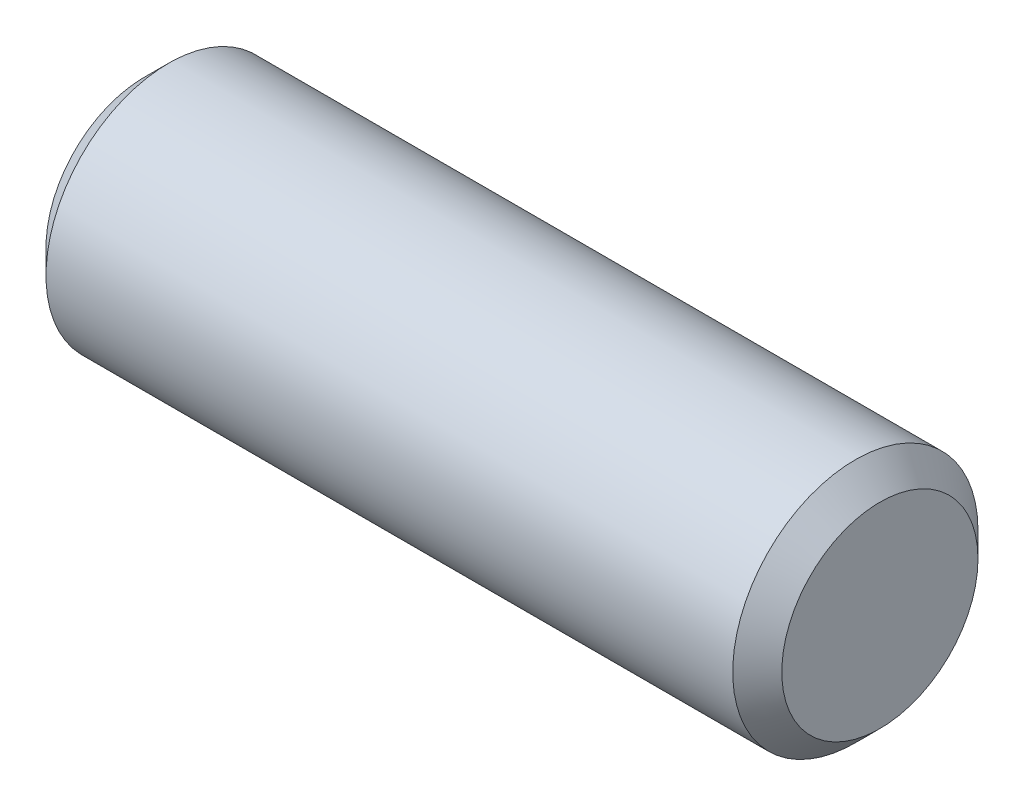
ISO-10303-21;
HEADER;
FILE_DESCRIPTION(('STEP AP214'),'2;1');
FILE_NAME('part.step','',(''),(''),'','','');
FILE_SCHEMA(('AUTOMOTIVE_DESIGN { 1 0 10303 214 1 1 1 1 }'));
ENDSEC;
DATA;
#1=APPLICATION_CONTEXT('core data for automotive mechanical design processes');
#2=APPLICATION_PROTOCOL_DEFINITION('international standard','automotive_design',2000,#1);
#3=PRODUCT_CONTEXT('',#1,'mechanical');
#4=PRODUCT('Part','Part','',(#3));
#5=PRODUCT_RELATED_PRODUCT_CATEGORY('part','',(#4));
#6=PRODUCT_DEFINITION_FORMATION('','',#4);
#7=PRODUCT_DEFINITION_CONTEXT('part definition',#1,'design');
#8=PRODUCT_DEFINITION('design','',#6,#7);
#9=PRODUCT_DEFINITION_SHAPE('','',#8);
#10=(LENGTH_UNIT() NAMED_UNIT(*) SI_UNIT(.MILLI.,.METRE.));
#11=(NAMED_UNIT(*) PLANE_ANGLE_UNIT() SI_UNIT($,.RADIAN.));
#12=(NAMED_UNIT(*) SI_UNIT($,.STERADIAN.) SOLID_ANGLE_UNIT());
#13=UNCERTAINTY_MEASURE_WITH_UNIT(LENGTH_MEASURE(1.E-05),#10,'distance_accuracy_value','');
#14=(GEOMETRIC_REPRESENTATION_CONTEXT(3) GLOBAL_UNCERTAINTY_ASSIGNED_CONTEXT((#13)) GLOBAL_UNIT_ASSIGNED_CONTEXT((#10,
#11,#12)) REPRESENTATION_CONTEXT('',''));
#15=CARTESIAN_POINT('',(0.,0.,0.));
#16=DIRECTION('',(0.,0.,1.));
#17=DIRECTION('',(1.,0.,0.));
#18=AXIS2_PLACEMENT_3D('',#15,#16,#17);
#19=CARTESIAN_POINT('',(-4.7625,0.,0.));
#20=DIRECTION('',(1.,0.,0.));
#21=DIRECTION('',(0.,0.,-1.));
#22=AXIS2_PLACEMENT_3D('',#19,#20,#21);
#23=CYLINDRICAL_SURFACE('',#22,1.5875);
#24=CARTESIAN_POINT('',(4.445,0.,0.));
#25=DIRECTION('',(1.,0.,0.));
#26=DIRECTION('',(0.,0.,-1.));
#27=AXIS2_PLACEMENT_3D('',#24,#25,#26);
#28=CIRCLE('',#27,1.5875);
#29=CARTESIAN_POINT('',(4.445,0.,-1.5875));
#30=VERTEX_POINT('',#29);
#31=EDGE_CURVE('E37',#30,#30,#28,.F.);
#32=CARTESIAN_POINT('',(-4.445,0.,0.));
#33=DIRECTION('',(1.,0.,0.));
#34=DIRECTION('',(0.,0.,-1.));
#35=AXIS2_PLACEMENT_3D('',#32,#33,#34);
#36=CIRCLE('',#35,1.5875);
#37=CARTESIAN_POINT('',(-4.445,0.,-1.5875));
#38=VERTEX_POINT('',#37);
#39=EDGE_CURVE('E41',#38,#38,#36,.T.);
#40=CARTESIAN_POINT('',(4.445,0.,-1.5875));
#41=CARTESIAN_POINT('',(4.35239583333334,0.,-1.5875));
#42=CARTESIAN_POINT('',(4.25979166666667,0.,-1.5875));
#43=CARTESIAN_POINT('',(4.07458333333333,0.,-1.5875));
#44=CARTESIAN_POINT('',(3.98197916666667,0.,-1.5875));
#45=CARTESIAN_POINT('',(3.79677083333334,0.,-1.5875));
#46=CARTESIAN_POINT('',(3.70416666666667,0.,-1.5875));
#47=CARTESIAN_POINT('',(3.51895833333334,0.,-1.5875));
#48=CARTESIAN_POINT('',(3.42635416666667,0.,-1.5875));
#49=CARTESIAN_POINT('',(3.24114583333334,0.,-1.5875));
#50=CARTESIAN_POINT('',(3.14854166666667,0.,-1.5875));
#51=CARTESIAN_POINT('',(2.96333333333334,0.,-1.5875));
#52=CARTESIAN_POINT('',(2.87072916666667,0.,-1.5875));
#53=CARTESIAN_POINT('',(2.68552083333334,0.,-1.5875));
#54=CARTESIAN_POINT('',(2.59291666666667,0.,-1.5875));
#55=CARTESIAN_POINT('',(2.40770833333334,0.,-1.5875));
#56=CARTESIAN_POINT('',(2.31510416666667,0.,-1.5875));
#57=CARTESIAN_POINT('',(2.12989583333334,0.,-1.5875));
#58=CARTESIAN_POINT('',(2.03729166666667,0.,-1.5875));
#59=CARTESIAN_POINT('',(1.85208333333334,0.,-1.5875));
#60=CARTESIAN_POINT('',(1.75947916666667,0.,-1.5875));
#61=CARTESIAN_POINT('',(1.57427083333334,0.,-1.5875));
#62=CARTESIAN_POINT('',(1.48166666666667,0.,-1.5875));
#63=CARTESIAN_POINT('',(1.29645833333334,0.,-1.5875));
#64=CARTESIAN_POINT('',(1.20385416666667,0.,-1.5875));
#65=CARTESIAN_POINT('',(1.01864583333334,0.,-1.5875));
#66=CARTESIAN_POINT('',(0.926041666666669,0.,-1.5875));
#67=CARTESIAN_POINT('',(0.740833333333336,0.,-1.5875));
#68=CARTESIAN_POINT('',(0.648229166666669,0.,-1.5875));
#69=CARTESIAN_POINT('',(0.463020833333336,0.,-1.5875));
#70=CARTESIAN_POINT('',(0.370416666666669,0.,-1.5875));
#71=CARTESIAN_POINT('',(0.185208333333336,0.,-1.5875));
#72=CARTESIAN_POINT('',(0.0926041666666694,0.,-1.5875));
#73=CARTESIAN_POINT('',(-0.0926041666666642,0.,-1.5875));
#74=CARTESIAN_POINT('',(-0.185208333333331,0.,-1.5875));
#75=CARTESIAN_POINT('',(-0.370416666666664,0.,-1.5875));
#76=CARTESIAN_POINT('',(-0.463020833333331,0.,-1.5875));
#77=CARTESIAN_POINT('',(-0.648229166666664,0.,-1.5875));
#78=CARTESIAN_POINT('',(-0.740833333333331,0.,-1.5875));
#79=CARTESIAN_POINT('',(-0.926041666666664,0.,-1.5875));
#80=CARTESIAN_POINT('',(-1.01864583333333,0.,-1.5875));
#81=CARTESIAN_POINT('',(-1.20385416666666,0.,-1.5875));
#82=CARTESIAN_POINT('',(-1.29645833333333,0.,-1.5875));
#83=CARTESIAN_POINT('',(-1.48166666666666,0.,-1.5875));
#84=CARTESIAN_POINT('',(-1.57427083333333,0.,-1.5875));
#85=CARTESIAN_POINT('',(-1.75947916666666,0.,-1.5875));
#86=CARTESIAN_POINT('',(-1.85208333333333,0.,-1.5875));
#87=CARTESIAN_POINT('',(-2.03729166666666,0.,-1.5875));
#88=CARTESIAN_POINT('',(-2.12989583333333,0.,-1.5875));
#89=CARTESIAN_POINT('',(-2.31510416666666,0.,-1.5875));
#90=CARTESIAN_POINT('',(-2.40770833333333,0.,-1.5875));
#91=CARTESIAN_POINT('',(-2.59291666666666,0.,-1.5875));
#92=CARTESIAN_POINT('',(-2.68552083333333,0.,-1.5875));
#93=CARTESIAN_POINT('',(-2.87072916666666,0.,-1.5875));
#94=CARTESIAN_POINT('',(-2.96333333333333,0.,-1.5875));
#95=CARTESIAN_POINT('',(-3.14854166666666,0.,-1.5875));
#96=CARTESIAN_POINT('',(-3.24114583333333,0.,-1.5875));
#97=CARTESIAN_POINT('',(-3.42635416666666,0.,-1.5875));
#98=CARTESIAN_POINT('',(-3.51895833333333,0.,-1.5875));
#99=CARTESIAN_POINT('',(-3.70416666666666,0.,-1.5875));
#100=CARTESIAN_POINT('',(-3.79677083333333,0.,-1.5875));
#101=CARTESIAN_POINT('',(-3.98197916666666,0.,-1.5875));
#102=CARTESIAN_POINT('',(-4.07458333333333,0.,-1.5875));
#103=CARTESIAN_POINT('',(-4.25979166666666,0.,-1.5875));
#104=CARTESIAN_POINT('',(-4.35239583333333,0.,-1.5875));
#105=CARTESIAN_POINT('',(-4.445,0.,-1.5875));
#106=B_SPLINE_CURVE_WITH_KNOTS('',3,(#40,#41,#42,#43,#44,#45,#46,#47,#48,#49,#50,#51,#52,#53,
#54,#55,#56,#57,#58,#59,#60,#61,#62,#63,#64,#65,#66,#67,#68,#69,#70,#71,#72,#73,#74,#75,#76,#77,
#78,#79,#80,#81,#82,#83,#84,#85,#86,#87,#88,#89,#90,#91,#92,#93,#94,#95,#96,#97,#98,#99,#100,
#101,#102,#103,#104,#105),.UNSPECIFIED.,.F.,.F.,(4,2,2,2,2,2,2,2,2,2,2,2,2,2,2,2,2,2,2,2,2,2,2,
2,2,2,2,2,2,2,2,2,4),(0.,0.2778125,0.555625000000001,0.833437499999999,1.11125,1.3890625,
1.666875,1.9446875,2.2225,2.5003125,2.778125,3.0559375,3.33375,3.6115625,3.889375,4.1671875,
4.445,4.7228125,5.000625,5.2784375,5.55625,5.8340625,6.111875,6.3896875,6.6675,6.9453125,
7.223125,7.5009375,7.77875,8.0565625,8.334375,8.6121875,8.89),.UNSPECIFIED.);
#107=EDGE_CURVE('BSEAM30',#30,#38,#106,.T.);
#108=ORIENTED_EDGE('',*,*,#31,.T.);
#109=ORIENTED_EDGE('',*,*,#39,.T.);
#110=ORIENTED_EDGE('',*,*,#107,.T.);
#111=ORIENTED_EDGE('',*,*,#107,.F.);
#112=EDGE_LOOP('',(#108,#110,#109,#111));
#113=FACE_BOUND('',#112,.T.);
#114=ADVANCED_FACE('F30',(#113),#23,.T.);
#115=CARTESIAN_POINT('',(-4.7625,0.,0.));
#116=DIRECTION('',(1.,0.,0.));
#117=DIRECTION('',(0.,0.,-1.));
#118=AXIS2_PLACEMENT_3D('',#115,#116,#117);
#119=PLANE('',#118);
#120=CARTESIAN_POINT('',(-4.7625,0.,0.));
#121=DIRECTION('',(1.,0.,0.));
#122=DIRECTION('',(0.,0.,-1.));
#123=AXIS2_PLACEMENT_3D('',#120,#121,#122);
#124=CIRCLE('',#123,1.27);
#125=CARTESIAN_POINT('',(-4.7625,0.,-1.27));
#126=VERTEX_POINT('',#125);
#127=EDGE_CURVE('E10',#126,#126,#124,.F.);
#128=ORIENTED_EDGE('',*,*,#127,.T.);
#129=EDGE_LOOP('',(#128));
#130=FACE_BOUND('',#129,.T.);
#131=ADVANCED_FACE('F61',(#130),#119,.F.);
#132=CARTESIAN_POINT('',(4.7625,0.,0.));
#133=DIRECTION('',(1.,0.,0.));
#134=DIRECTION('',(0.,0.,-1.));
#135=AXIS2_PLACEMENT_3D('',#132,#133,#134);
#136=PLANE('',#135);
#137=CARTESIAN_POINT('',(4.7625,0.,0.));
#138=DIRECTION('',(1.,0.,0.));
#139=DIRECTION('',(0.,0.,-1.));
#140=AXIS2_PLACEMENT_3D('',#137,#138,#139);
#141=CIRCLE('',#140,1.27);
#142=CARTESIAN_POINT('',(4.7625,0.,-1.27));
#143=VERTEX_POINT('',#142);
#144=EDGE_CURVE('E45',#143,#143,#141,.T.);
#145=ORIENTED_EDGE('',*,*,#144,.T.);
#146=EDGE_LOOP('',(#145));
#147=FACE_BOUND('',#146,.T.);
#148=ADVANCED_FACE('F51',(#147),#136,.T.);
#149=CARTESIAN_POINT('',(4.7625,0.,0.));
#150=DIRECTION('',(-1.,0.,0.));
#151=DIRECTION('',(0.,0.,1.));
#152=AXIS2_PLACEMENT_3D('',#149,#150,#151);
#153=CONICAL_SURFACE('',#152,1.27,0.78539816339745);
#154=ORIENTED_EDGE('',*,*,#31,.F.);
#155=EDGE_LOOP('',(#154));
#156=FACE_BOUND('',#155,.T.);
#157=ORIENTED_EDGE('',*,*,#144,.F.);
#158=EDGE_LOOP('',(#157));
#159=FACE_BOUND('',#158,.T.);
#160=ADVANCED_FACE('F53',(#156,#159),#153,.T.);
#161=CARTESIAN_POINT('',(-4.445,0.,0.));
#162=DIRECTION('',(1.,0.,0.));
#163=DIRECTION('',(0.,0.,-1.));
#164=AXIS2_PLACEMENT_3D('',#161,#162,#163);
#165=CONICAL_SURFACE('',#164,1.5875,0.785398163397448);
#166=ORIENTED_EDGE('',*,*,#127,.F.);
#167=EDGE_LOOP('',(#166));
#168=FACE_BOUND('',#167,.T.);
#169=ORIENTED_EDGE('',*,*,#39,.F.);
#170=EDGE_LOOP('',(#169));
#171=FACE_BOUND('',#170,.T.);
#172=ADVANCED_FACE('F32',(#168,#171),#165,.T.);
#173=CLOSED_SHELL('',(#114,#131,#148,#160,#172));
#174=MANIFOLD_SOLID_BREP('B2',#173);
#175=ADVANCED_BREP_SHAPE_REPRESENTATION('',(#18,#174),#14);
#176=SHAPE_DEFINITION_REPRESENTATION(#9,#175);
ENDSEC;
END-ISO-10303-21;
